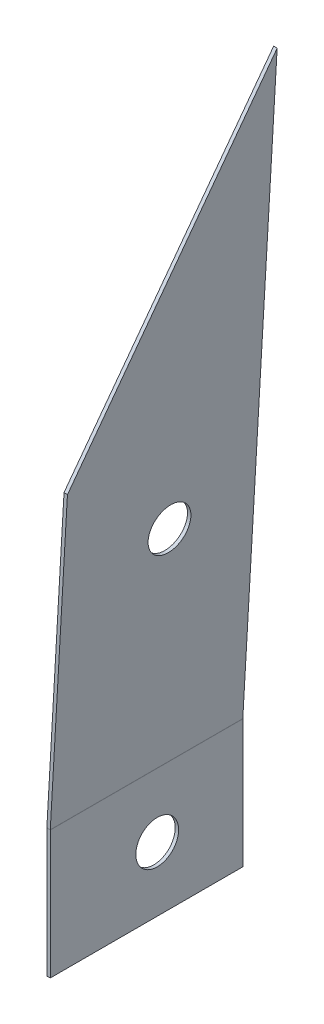
ISO-10303-21;
HEADER;
FILE_DESCRIPTION(('STEP AP214'),'2;1');
FILE_NAME('part.step','',(''),(''),'','','');
FILE_SCHEMA(('AUTOMOTIVE_DESIGN { 1 0 10303 214 1 1 1 1 }'));
ENDSEC;
DATA;
#1=APPLICATION_CONTEXT('core data for automotive mechanical design processes');
#2=APPLICATION_PROTOCOL_DEFINITION('international standard','automotive_design',2000,#1);
#3=PRODUCT_CONTEXT('',#1,'mechanical');
#4=PRODUCT('Part','Part','',(#3));
#5=PRODUCT_RELATED_PRODUCT_CATEGORY('part','',(#4));
#6=PRODUCT_DEFINITION_FORMATION('','',#4);
#7=PRODUCT_DEFINITION_CONTEXT('part definition',#1,'design');
#8=PRODUCT_DEFINITION('design','',#6,#7);
#9=PRODUCT_DEFINITION_SHAPE('','',#8);
#10=(LENGTH_UNIT() NAMED_UNIT(*) SI_UNIT(.MILLI.,.METRE.));
#11=(NAMED_UNIT(*) PLANE_ANGLE_UNIT() SI_UNIT($,.RADIAN.));
#12=(NAMED_UNIT(*) SI_UNIT($,.STERADIAN.) SOLID_ANGLE_UNIT());
#13=UNCERTAINTY_MEASURE_WITH_UNIT(LENGTH_MEASURE(1.E-05),#10,'distance_accuracy_value','');
#14=(GEOMETRIC_REPRESENTATION_CONTEXT(3) GLOBAL_UNCERTAINTY_ASSIGNED_CONTEXT((#13)) GLOBAL_UNIT_ASSIGNED_CONTEXT((#10,
#11,#12)) REPRESENTATION_CONTEXT('',''));
#15=CARTESIAN_POINT('',(0.,0.,0.));
#16=DIRECTION('',(0.,0.,1.));
#17=DIRECTION('',(1.,0.,0.));
#18=AXIS2_PLACEMENT_3D('',#15,#16,#17);
#19=CARTESIAN_POINT('',(4.00000000000004,149.770251539571,225.));
#20=DIRECTION('',(0.,0.,1.));
#21=DIRECTION('',(1.,0.,0.));
#22=AXIS2_PLACEMENT_3D('',#19,#20,#21);
#23=PLANE('',#22);
#24=DIRECTION('',(0.0573897825660991,0.998351848226374,0.));
#25=VECTOR('',#24,1.);
#26=CARTESIAN_POINT('',(3.99340739290549,149.770440869736,225.));
#27=LINE('',#26,#25);
#28=CARTESIAN_POINT('',(4.00659260709458,149.999810669835,225.));
#29=VERTEX_POINT('',#28);
#30=CARTESIAN_POINT('',(24.0798312910402,499.193587748967,225.));
#31=VERTEX_POINT('',#30);
#32=EDGE_CURVE('E157',#29,#31,#27,.T.);
#33=ORIENTED_EDGE('',*,*,#32,.T.);
#34=DIRECTION('',(0.998351848226373,-0.0573897825660991,0.));
#35=VECTOR('',#34,1.);
#36=CARTESIAN_POINT('',(24.0798312910402,499.193587748967,225.));
#37=LINE('',#36,#35);
#38=CARTESIAN_POINT('',(20.0864238981347,499.423146879231,225.));
#39=VERTEX_POINT('',#38);
#40=EDGE_CURVE('E142',#31,#39,#37,.F.);
#41=ORIENTED_EDGE('',*,*,#40,.T.);
#42=DIRECTION('',(0.0573897825660991,0.998351848226373,0.));
#43=VECTOR('',#42,1.);
#44=CARTESIAN_POINT('',(0.,150.,225.));
#45=LINE('',#44,#43);
#46=CARTESIAN_POINT('',(0.0131852141890862,150.229369800099,225.));
#47=VERTEX_POINT('',#46);
#48=EDGE_CURVE('E177',#47,#39,#45,.T.);
#49=ORIENTED_EDGE('',*,*,#48,.F.);
#50=DIRECTION('',(0.998351848226373,-0.0573897825661002,0.));
#51=VECTOR('',#50,1.);
#52=CARTESIAN_POINT('',(0.0131852141890862,150.229369800099,225.));
#53=LINE('',#52,#51);
#54=EDGE_CURVE('E11',#47,#29,#53,.T.);
#55=ORIENTED_EDGE('',*,*,#54,.T.);
#56=EDGE_LOOP('',(#33,#41,#49,#55));
#57=FACE_BOUND('',#56,.T.);
#58=ADVANCED_FACE('F38',(#57),#23,.T.);
#59=CARTESIAN_POINT('',(3.99340739290549,149.770440869736,225.));
#60=DIRECTION('',(-0.998351848226373,0.0573897825660991,0.));
#61=DIRECTION('',(-0.0573897825660991,-0.998351848226374,0.));
#62=AXIS2_PLACEMENT_3D('',#59,#60,#61);
#63=PLANE('',#62);
#64=CARTESIAN_POINT('',(18.3408530344303,399.358402926329,100.));
#65=DIRECTION('',(-0.998351848226373,0.0573897825660991,0.));
#66=DIRECTION('',(-0.0573897825660991,-0.998351848226374,0.));
#67=AXIS2_PLACEMENT_3D('',#64,#65,#66);
#68=CIRCLE('',#67,25.);
#69=CARTESIAN_POINT('',(16.9061084702778,374.39960672067,100.));
#70=VERTEX_POINT('',#69);
#71=EDGE_CURVE('E218',#70,#70,#68,.T.);
#72=ORIENTED_EDGE('',*,*,#71,.T.);
#73=EDGE_LOOP('',(#72));
#74=FACE_BOUND('',#73,.T.);
#75=DIRECTION('',(-0.0482750498011431,-0.839792085580425,0.540757591313499));
#76=VECTOR('',#75,1.);
#77=CARTESIAN_POINT('',(9.86705481438171,251.948328585323,384.205776173285));
#78=LINE('',#77,#76);
#79=CARTESIAN_POINT('',(44.1662551891749,848.616734628197,0.));
#80=VERTEX_POINT('',#79);
#81=EDGE_CURVE('E211',#80,#31,#78,.T.);
#82=ORIENTED_EDGE('',*,*,#81,.T.);
#83=ORIENTED_EDGE('',*,*,#32,.F.);
#84=DIRECTION('',(0.,0.,-1.));
#85=VECTOR('',#84,1.);
#86=CARTESIAN_POINT('',(4.00659260709458,149.999810669835,225.));
#87=LINE('',#86,#85);
#88=CARTESIAN_POINT('',(4.00659260709458,149.999810669835,0.));
#89=VERTEX_POINT('',#88);
#90=EDGE_CURVE('E137',#29,#89,#87,.T.);
#91=ORIENTED_EDGE('',*,*,#90,.T.);
#92=DIRECTION('',(0.0573897825660991,0.998351848226374,0.));
#93=VECTOR('',#92,1.);
#94=CARTESIAN_POINT('',(3.99340739290549,149.770440869736,0.));
#95=LINE('',#94,#93);
#96=EDGE_CURVE('E138',#89,#80,#95,.T.);
#97=ORIENTED_EDGE('',*,*,#96,.T.);
#98=EDGE_LOOP('',(#82,#83,#91,#97));
#99=FACE_BOUND('',#98,.T.);
#100=ADVANCED_FACE('F193',(#74,#99),#63,.F.);
#101=CARTESIAN_POINT('',(0.,150.,225.));
#102=DIRECTION('',(-0.998351848226374,0.0573897825660991,0.));
#103=DIRECTION('',(-0.0573897825660991,-0.998351848226374,0.));
#104=AXIS2_PLACEMENT_3D('',#101,#102,#103);
#105=PLANE('',#104);
#106=CARTESIAN_POINT('',(14.3474456415248,399.587962056594,100.));
#107=DIRECTION('',(-0.998351848226374,0.0573897825660991,0.));
#108=DIRECTION('',(-0.0573897825660991,-0.998351848226373,0.));
#109=AXIS2_PLACEMENT_3D('',#106,#107,#108);
#110=CIRCLE('',#109,25.);
#111=CARTESIAN_POINT('',(12.9127010773723,374.629165850934,100.));
#112=VERTEX_POINT('',#111);
#113=EDGE_CURVE('E221',#112,#112,#110,.T.);
#114=ORIENTED_EDGE('',*,*,#113,.F.);
#115=EDGE_LOOP('',(#114));
#116=FACE_BOUND('',#115,.T.);
#117=ORIENTED_EDGE('',*,*,#48,.T.);
#118=DIRECTION('',(-0.0482750498011431,-0.839792085580425,0.540757591313499));
#119=VECTOR('',#118,1.);
#120=CARTESIAN_POINT('',(5.87364742147621,252.177887715587,384.205776173285));
#121=LINE('',#120,#119);
#122=CARTESIAN_POINT('',(40.1728477962694,848.846293758462,0.));
#123=VERTEX_POINT('',#122);
#124=EDGE_CURVE('E210',#123,#39,#121,.T.);
#125=ORIENTED_EDGE('',*,*,#124,.F.);
#126=DIRECTION('',(0.0573897825660991,0.998351848226373,0.));
#127=VECTOR('',#126,1.);
#128=CARTESIAN_POINT('',(0.,150.,0.));
#129=LINE('',#128,#127);
#130=CARTESIAN_POINT('',(0.0131852141890862,150.229369800099,0.));
#131=VERTEX_POINT('',#130);
#132=EDGE_CURVE('E145',#131,#123,#129,.T.);
#133=ORIENTED_EDGE('',*,*,#132,.F.);
#134=DIRECTION('',(0.,0.,-1.));
#135=VECTOR('',#134,1.);
#136=CARTESIAN_POINT('',(0.0131852141890862,150.229369800099,225.));
#137=LINE('',#136,#135);
#138=EDGE_CURVE('E165',#47,#131,#137,.T.);
#139=ORIENTED_EDGE('',*,*,#138,.F.);
#140=EDGE_LOOP('',(#117,#125,#133,#139));
#141=FACE_BOUND('',#140,.T.);
#142=ADVANCED_FACE('F191',(#116,#141),#105,.T.);
#143=CARTESIAN_POINT('',(0.0131852141890862,150.229369800099,225.));
#144=DIRECTION('',(0.,0.,1.));
#145=DIRECTION('',(1.,0.,0.));
#146=AXIS2_PLACEMENT_3D('',#143,#144,#145);
#147=PLANE('',#146);
#148=ORIENTED_EDGE('',*,*,#54,.F.);
#149=CARTESIAN_POINT('',(8.00000000000004,149.770251539571,225.));
#150=DIRECTION('',(0.,0.,1.));
#151=DIRECTION('',(1.,0.,0.));
#152=AXIS2_PLACEMENT_3D('',#149,#150,#151);
#153=CIRCLE('',#152,8.);
#154=CARTESIAN_POINT('',(0.,149.770251539571,225.));
#155=VERTEX_POINT('',#154);
#156=EDGE_CURVE('E132',#155,#47,#153,.F.);
#157=ORIENTED_EDGE('',*,*,#156,.F.);
#158=DIRECTION('',(-1.,0.,0.));
#159=VECTOR('',#158,1.);
#160=CARTESIAN_POINT('',(4.00000000000004,149.770251539571,225.));
#161=LINE('',#160,#159);
#162=CARTESIAN_POINT('',(4.00000000000004,149.770251539571,225.));
#163=VERTEX_POINT('',#162);
#164=EDGE_CURVE('E48',#163,#155,#161,.T.);
#165=ORIENTED_EDGE('',*,*,#164,.F.);
#166=CARTESIAN_POINT('',(8.00000000000004,149.770251539571,225.));
#167=DIRECTION('',(0.,0.,1.));
#168=DIRECTION('',(1.,0.,0.));
#169=AXIS2_PLACEMENT_3D('',#166,#167,#168);
#170=CIRCLE('',#169,4.);
#171=EDGE_CURVE('E125',#163,#29,#170,.F.);
#172=ORIENTED_EDGE('',*,*,#171,.T.);
#173=EDGE_LOOP('',(#148,#157,#165,#172));
#174=FACE_BOUND('',#173,.T.);
#175=ADVANCED_FACE('F40',(#174),#147,.T.);
#176=CARTESIAN_POINT('',(0.,149.770251539571,0.));
#177=DIRECTION('',(0.,0.,-1.));
#178=DIRECTION('',(-1.,0.,0.));
#179=AXIS2_PLACEMENT_3D('',#176,#177,#178);
#180=PLANE('',#179);
#181=DIRECTION('',(1.,0.,0.));
#182=VECTOR('',#181,1.);
#183=CARTESIAN_POINT('',(0.,149.770251539571,0.));
#184=LINE('',#183,#182);
#185=CARTESIAN_POINT('',(0.,149.770251539571,0.));
#186=VERTEX_POINT('',#185);
#187=CARTESIAN_POINT('',(4.00000000000004,149.770251539571,0.));
#188=VERTEX_POINT('',#187);
#189=EDGE_CURVE('E81',#186,#188,#184,.T.);
#190=ORIENTED_EDGE('',*,*,#189,.F.);
#191=CARTESIAN_POINT('',(8.00000000000004,149.770251539571,0.));
#192=DIRECTION('',(0.,0.,1.));
#193=DIRECTION('',(1.,0.,0.));
#194=AXIS2_PLACEMENT_3D('',#191,#192,#193);
#195=CIRCLE('',#194,8.);
#196=EDGE_CURVE('E148',#186,#131,#195,.F.);
#197=ORIENTED_EDGE('',*,*,#196,.T.);
#198=DIRECTION('',(-0.998351848226373,0.0573897825661002,0.));
#199=VECTOR('',#198,1.);
#200=CARTESIAN_POINT('',(4.00659260709458,149.999810669835,0.));
#201=LINE('',#200,#199);
#202=EDGE_CURVE('E88',#89,#131,#201,.T.);
#203=ORIENTED_EDGE('',*,*,#202,.F.);
#204=CARTESIAN_POINT('',(8.00000000000004,149.770251539571,0.));
#205=DIRECTION('',(0.,0.,1.));
#206=DIRECTION('',(1.,0.,0.));
#207=AXIS2_PLACEMENT_3D('',#204,#205,#206);
#208=CIRCLE('',#207,4.);
#209=EDGE_CURVE('E155',#188,#89,#208,.F.);
#210=ORIENTED_EDGE('',*,*,#209,.F.);
#211=EDGE_LOOP('',(#190,#197,#203,#210));
#212=FACE_BOUND('',#211,.T.);
#213=ADVANCED_FACE('F183',(#212),#180,.T.);
#214=CARTESIAN_POINT('',(4.00659260709458,149.999810669835,0.));
#215=DIRECTION('',(0.,0.,-1.));
#216=DIRECTION('',(-1.,0.,0.));
#217=AXIS2_PLACEMENT_3D('',#214,#215,#216);
#218=PLANE('',#217);
#219=DIRECTION('',(0.,1.,0.));
#220=VECTOR('',#219,1.);
#221=CARTESIAN_POINT('',(0.,0.,0.));
#222=LINE('',#221,#220);
#223=CARTESIAN_POINT('',(0.,0.,0.));
#224=VERTEX_POINT('',#223);
#225=EDGE_CURVE('E150',#224,#186,#222,.T.);
#226=ORIENTED_EDGE('',*,*,#225,.T.);
#227=ORIENTED_EDGE('',*,*,#189,.T.);
#228=DIRECTION('',(0.,1.,0.));
#229=VECTOR('',#228,1.);
#230=CARTESIAN_POINT('',(4.,0.,0.));
#231=LINE('',#230,#229);
#232=CARTESIAN_POINT('',(4.,0.,0.));
#233=VERTEX_POINT('',#232);
#234=EDGE_CURVE('E153',#233,#188,#231,.T.);
#235=ORIENTED_EDGE('',*,*,#234,.F.);
#236=DIRECTION('',(-1.,0.,0.));
#237=VECTOR('',#236,1.);
#238=CARTESIAN_POINT('',(4.,0.,0.));
#239=LINE('',#238,#237);
#240=EDGE_CURVE('E113',#233,#224,#239,.T.);
#241=ORIENTED_EDGE('',*,*,#240,.T.);
#242=EDGE_LOOP('',(#226,#227,#235,#241));
#243=FACE_BOUND('',#242,.T.);
#244=ADVANCED_FACE('F179',(#243),#218,.T.);
#245=CARTESIAN_POINT('',(8.00000000000004,149.770251539571,225.));
#246=DIRECTION('',(0.,0.,-1.));
#247=DIRECTION('',(-1.,0.,0.));
#248=AXIS2_PLACEMENT_3D('',#245,#246,#247);
#249=CYLINDRICAL_SURFACE('',#248,8.);
#250=ORIENTED_EDGE('',*,*,#196,.F.);
#251=DIRECTION('',(0.,0.,-1.));
#252=VECTOR('',#251,1.);
#253=CARTESIAN_POINT('',(0.,149.770251539571,225.));
#254=LINE('',#253,#252);
#255=EDGE_CURVE('E162',#155,#186,#254,.T.);
#256=ORIENTED_EDGE('',*,*,#255,.F.);
#257=ORIENTED_EDGE('',*,*,#156,.T.);
#258=ORIENTED_EDGE('',*,*,#138,.T.);
#259=EDGE_LOOP('',(#250,#256,#257,#258));
#260=FACE_BOUND('',#259,.T.);
#261=ADVANCED_FACE('F174',(#260),#249,.T.);
#262=CARTESIAN_POINT('',(0.,0.,225.));
#263=DIRECTION('',(-1.,0.,0.));
#264=DIRECTION('',(0.,0.,1.));
#265=AXIS2_PLACEMENT_3D('',#262,#263,#264);
#266=PLANE('',#265);
#267=CARTESIAN_POINT('',(0.,75.,100.));
#268=DIRECTION('',(-1.,0.,0.));
#269=DIRECTION('',(0.,0.,1.));
#270=AXIS2_PLACEMENT_3D('',#267,#268,#269);
#271=CIRCLE('',#270,25.);
#272=CARTESIAN_POINT('',(0.,75.,125.));
#273=VERTEX_POINT('',#272);
#274=EDGE_CURVE('E215',#273,#273,#271,.T.);
#275=ORIENTED_EDGE('',*,*,#274,.F.);
#276=EDGE_LOOP('',(#275));
#277=FACE_BOUND('',#276,.T.);
#278=ORIENTED_EDGE('',*,*,#225,.F.);
#279=DIRECTION('',(0.,0.,-1.));
#280=VECTOR('',#279,1.);
#281=CARTESIAN_POINT('',(0.,0.,225.));
#282=LINE('',#281,#280);
#283=CARTESIAN_POINT('',(0.,0.,225.));
#284=VERTEX_POINT('',#283);
#285=EDGE_CURVE('E115',#284,#224,#282,.T.);
#286=ORIENTED_EDGE('',*,*,#285,.F.);
#287=DIRECTION('',(0.,1.,0.));
#288=VECTOR('',#287,1.);
#289=CARTESIAN_POINT('',(0.,0.,225.));
#290=LINE('',#289,#288);
#291=EDGE_CURVE('E130',#284,#155,#290,.T.);
#292=ORIENTED_EDGE('',*,*,#291,.T.);
#293=ORIENTED_EDGE('',*,*,#255,.T.);
#294=EDGE_LOOP('',(#278,#286,#292,#293));
#295=FACE_BOUND('',#294,.T.);
#296=ADVANCED_FACE('F178',(#277,#295),#266,.T.);
#297=CARTESIAN_POINT('',(4.,0.,225.));
#298=DIRECTION('',(0.,-1.,0.));
#299=DIRECTION('',(0.,0.,-1.));
#300=AXIS2_PLACEMENT_3D('',#297,#298,#299);
#301=PLANE('',#300);
#302=ORIENTED_EDGE('',*,*,#240,.F.);
#303=DIRECTION('',(0.,0.,-1.));
#304=VECTOR('',#303,1.);
#305=CARTESIAN_POINT('',(4.,0.,225.));
#306=LINE('',#305,#304);
#307=CARTESIAN_POINT('',(4.,0.,225.));
#308=VERTEX_POINT('',#307);
#309=EDGE_CURVE('E107',#308,#233,#306,.T.);
#310=ORIENTED_EDGE('',*,*,#309,.F.);
#311=DIRECTION('',(-1.,0.,0.));
#312=VECTOR('',#311,1.);
#313=CARTESIAN_POINT('',(4.,0.,225.));
#314=LINE('',#313,#312);
#315=EDGE_CURVE('E111',#308,#284,#314,.T.);
#316=ORIENTED_EDGE('',*,*,#315,.T.);
#317=ORIENTED_EDGE('',*,*,#285,.T.);
#318=EDGE_LOOP('',(#302,#310,#316,#317));
#319=FACE_BOUND('',#318,.T.);
#320=ADVANCED_FACE('F109',(#319),#301,.T.);
#321=CARTESIAN_POINT('',(4.,0.,225.));
#322=DIRECTION('',(-1.,0.,0.));
#323=DIRECTION('',(0.,0.,1.));
#324=AXIS2_PLACEMENT_3D('',#321,#322,#323);
#325=PLANE('',#324);
#326=CARTESIAN_POINT('',(4.,75.,100.));
#327=DIRECTION('',(-1.,0.,0.));
#328=DIRECTION('',(0.,0.,1.));
#329=AXIS2_PLACEMENT_3D('',#326,#327,#328);
#330=CIRCLE('',#329,25.);
#331=CARTESIAN_POINT('',(4.,75.,125.));
#332=VERTEX_POINT('',#331);
#333=EDGE_CURVE('E42',#332,#332,#330,.T.);
#334=ORIENTED_EDGE('',*,*,#333,.T.);
#335=EDGE_LOOP('',(#334));
#336=FACE_BOUND('',#335,.T.);
#337=ORIENTED_EDGE('',*,*,#234,.T.);
#338=DIRECTION('',(0.,0.,-1.));
#339=VECTOR('',#338,1.);
#340=CARTESIAN_POINT('',(4.00000000000004,149.770251539571,225.));
#341=LINE('',#340,#339);
#342=EDGE_CURVE('E116',#163,#188,#341,.T.);
#343=ORIENTED_EDGE('',*,*,#342,.F.);
#344=DIRECTION('',(0.,1.,0.));
#345=VECTOR('',#344,1.);
#346=CARTESIAN_POINT('',(4.,0.,225.));
#347=LINE('',#346,#345);
#348=EDGE_CURVE('E120',#308,#163,#347,.T.);
#349=ORIENTED_EDGE('',*,*,#348,.F.);
#350=ORIENTED_EDGE('',*,*,#309,.T.);
#351=EDGE_LOOP('',(#337,#343,#349,#350));
#352=FACE_BOUND('',#351,.T.);
#353=ADVANCED_FACE('F121',(#336,#352),#325,.F.);
#354=CARTESIAN_POINT('',(8.00000000000004,149.770251539571,225.));
#355=DIRECTION('',(0.,0.,-1.));
#356=DIRECTION('',(-1.,0.,0.));
#357=AXIS2_PLACEMENT_3D('',#354,#355,#356);
#358=CYLINDRICAL_SURFACE('',#357,4.);
#359=ORIENTED_EDGE('',*,*,#209,.T.);
#360=ORIENTED_EDGE('',*,*,#90,.F.);
#361=ORIENTED_EDGE('',*,*,#171,.F.);
#362=ORIENTED_EDGE('',*,*,#342,.T.);
#363=EDGE_LOOP('',(#359,#360,#361,#362));
#364=FACE_BOUND('',#363,.T.);
#365=ADVANCED_FACE('F181',(#364),#358,.F.);
#366=CARTESIAN_POINT('',(8.00000000000004,149.770251539571,225.));
#367=DIRECTION('',(0.,0.,1.));
#368=DIRECTION('',(1.,0.,0.));
#369=AXIS2_PLACEMENT_3D('',#366,#367,#368);
#370=PLANE('',#369);
#371=ORIENTED_EDGE('',*,*,#348,.T.);
#372=ORIENTED_EDGE('',*,*,#164,.T.);
#373=ORIENTED_EDGE('',*,*,#291,.F.);
#374=ORIENTED_EDGE('',*,*,#315,.F.);
#375=EDGE_LOOP('',(#371,#372,#373,#374));
#376=FACE_BOUND('',#375,.T.);
#377=ADVANCED_FACE('F128',(#376),#370,.T.);
#378=CARTESIAN_POINT('',(8.00000000000004,149.770251539571,0.));
#379=DIRECTION('',(0.,0.,1.));
#380=DIRECTION('',(1.,0.,0.));
#381=AXIS2_PLACEMENT_3D('',#378,#379,#380);
#382=PLANE('',#381);
#383=ORIENTED_EDGE('',*,*,#96,.F.);
#384=ORIENTED_EDGE('',*,*,#202,.T.);
#385=ORIENTED_EDGE('',*,*,#132,.T.);
#386=DIRECTION('',(0.998351848226377,-0.0573897825660308,0.));
#387=VECTOR('',#386,1.);
#388=CARTESIAN_POINT('',(40.1728477962693,848.846293758461,0.));
#389=LINE('',#388,#387);
#390=EDGE_CURVE('E141',#123,#80,#389,.T.);
#391=ORIENTED_EDGE('',*,*,#390,.T.);
#392=EDGE_LOOP('',(#383,#384,#385,#391));
#393=FACE_BOUND('',#392,.T.);
#394=ADVANCED_FACE('F239',(#393),#382,.F.);
#395=CARTESIAN_POINT('',(9.86705481438171,251.948328585323,384.205776173285));
#396=DIRECTION('',(-0.0310339605864492,-0.539866340730273,-0.841178475376554));
#397=DIRECTION('',(-0.0482750498011431,-0.839792085580425,0.540757591313499));
#398=AXIS2_PLACEMENT_3D('',#395,#396,#397);
#399=PLANE('',#398);
#400=ORIENTED_EDGE('',*,*,#40,.F.);
#401=ORIENTED_EDGE('',*,*,#81,.F.);
#402=ORIENTED_EDGE('',*,*,#390,.F.);
#403=ORIENTED_EDGE('',*,*,#124,.T.);
#404=EDGE_LOOP('',(#400,#401,#402,#403));
#405=FACE_BOUND('',#404,.T.);
#406=ADVANCED_FACE('F236',(#405),#399,.F.);
#407=CARTESIAN_POINT('',(10.,75.,100.));
#408=DIRECTION('',(-1.,0.,0.));
#409=DIRECTION('',(0.,0.,1.));
#410=AXIS2_PLACEMENT_3D('',#407,#408,#409);
#411=CYLINDRICAL_SURFACE('',#410,25.);
#412=ORIENTED_EDGE('',*,*,#274,.T.);
#413=EDGE_LOOP('',(#412));
#414=FACE_BOUND('',#413,.T.);
#415=ORIENTED_EDGE('',*,*,#333,.F.);
#416=EDGE_LOOP('',(#415));
#417=FACE_BOUND('',#416,.T.);
#418=ADVANCED_FACE('F246',(#414,#417),#411,.F.);
#419=CARTESIAN_POINT('',(24.3309641237885,399.014064230933,100.));
#420=DIRECTION('',(-0.998351848226373,0.0573897825660991,0.));
#421=DIRECTION('',(-0.0573897825660991,-0.998351848226374,0.));
#422=AXIS2_PLACEMENT_3D('',#419,#420,#421);
#423=CYLINDRICAL_SURFACE('',#422,25.);
#424=ORIENTED_EDGE('',*,*,#113,.T.);
#425=EDGE_LOOP('',(#424));
#426=FACE_BOUND('',#425,.T.);
#427=ORIENTED_EDGE('',*,*,#71,.F.);
#428=EDGE_LOOP('',(#427));
#429=FACE_BOUND('',#428,.T.);
#430=ADVANCED_FACE('F225',(#426,#429),#423,.F.);
#431=CLOSED_SHELL('',(#58,#100,#142,#175,#213,#244,#261,#296,#320,#353,#365,#377,#394,#406,#418,#430));
#432=MANIFOLD_SOLID_BREP('B2',#431);
#433=ADVANCED_BREP_SHAPE_REPRESENTATION('',(#18,#432),#14);
#434=SHAPE_DEFINITION_REPRESENTATION(#9,#433);
ENDSEC;
END-ISO-10303-21;
